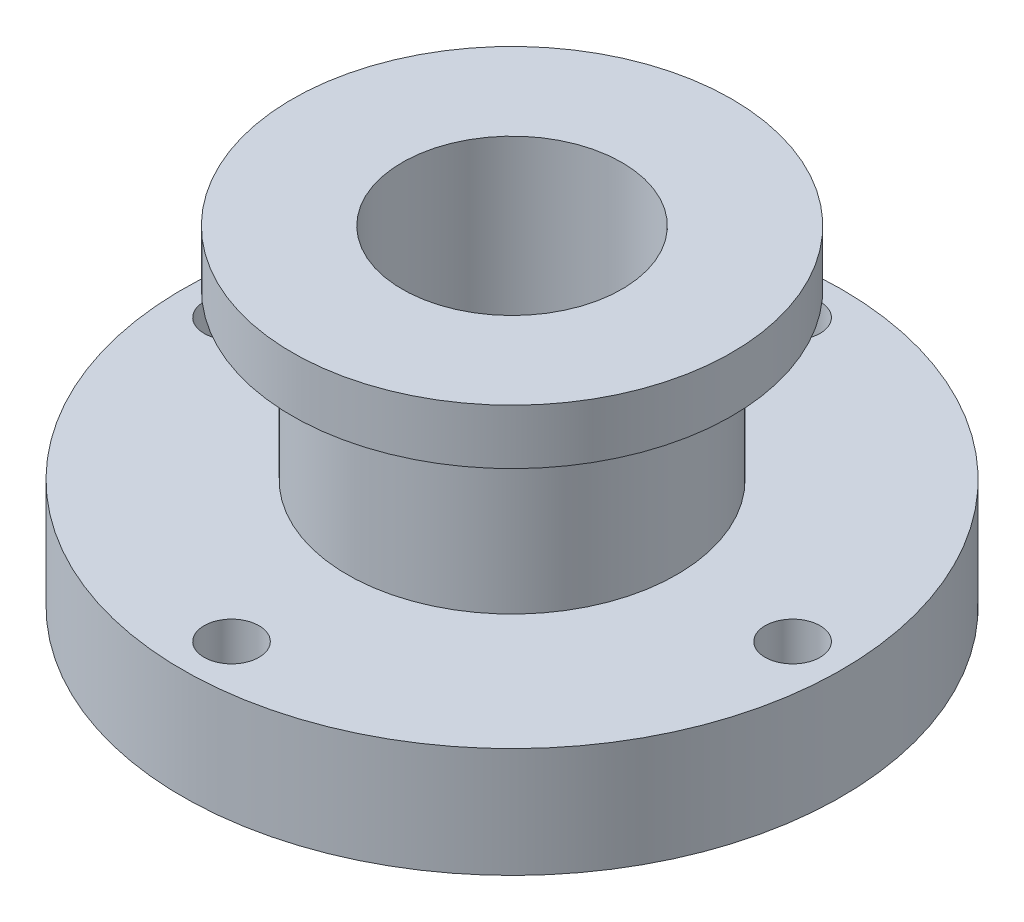
ISO-10303-21;
HEADER;
FILE_DESCRIPTION(('STEP AP214'),'2;1');
FILE_NAME('part.step','',(''),(''),'','','');
FILE_SCHEMA(('AUTOMOTIVE_DESIGN { 1 0 10303 214 1 1 1 1 }'));
ENDSEC;
DATA;
#1=APPLICATION_CONTEXT('core data for automotive mechanical design processes');
#2=APPLICATION_PROTOCOL_DEFINITION('international standard','automotive_design',2000,#1);
#3=PRODUCT_CONTEXT('',#1,'mechanical');
#4=PRODUCT('Part','Part','',(#3));
#5=PRODUCT_RELATED_PRODUCT_CATEGORY('part','',(#4));
#6=PRODUCT_DEFINITION_FORMATION('','',#4);
#7=PRODUCT_DEFINITION_CONTEXT('part definition',#1,'design');
#8=PRODUCT_DEFINITION('design','',#6,#7);
#9=PRODUCT_DEFINITION_SHAPE('','',#8);
#10=(LENGTH_UNIT() NAMED_UNIT(*) SI_UNIT(.MILLI.,.METRE.));
#11=(NAMED_UNIT(*) PLANE_ANGLE_UNIT() SI_UNIT($,.RADIAN.));
#12=(NAMED_UNIT(*) SI_UNIT($,.STERADIAN.) SOLID_ANGLE_UNIT());
#13=UNCERTAINTY_MEASURE_WITH_UNIT(LENGTH_MEASURE(1.E-05),#10,'distance_accuracy_value','');
#14=(GEOMETRIC_REPRESENTATION_CONTEXT(3) GLOBAL_UNCERTAINTY_ASSIGNED_CONTEXT((#13)) GLOBAL_UNIT_ASSIGNED_CONTEXT((#10,
#11,#12)) REPRESENTATION_CONTEXT('',''));
#15=CARTESIAN_POINT('',(0.,0.,0.));
#16=DIRECTION('',(0.,0.,1.));
#17=DIRECTION('',(1.,0.,0.));
#18=AXIS2_PLACEMENT_3D('',#15,#16,#17);
#19=CARTESIAN_POINT('',(0.,-251.612903225806,0.));
#20=DIRECTION('',(0.,-1.,0.));
#21=DIRECTION('',(0.,0.,-1.));
#22=AXIS2_PLACEMENT_3D('',#19,#20,#21);
#23=PLANE('',#22);
#24=CARTESIAN_POINT('',(0.,-251.612903225806,-255.365455534732));
#25=DIRECTION('',(0.,1.,0.));
#26=DIRECTION('',(0.,0.,1.));
#27=AXIS2_PLACEMENT_3D('',#24,#25,#26);
#28=CIRCLE('',#27,25.);
#29=CARTESIAN_POINT('',(0.,-251.612903225806,-230.365455534732));
#30=VERTEX_POINT('',#29);
#31=EDGE_CURVE('E65',#30,#30,#28,.T.);
#32=ORIENTED_EDGE('',*,*,#31,.T.);
#33=EDGE_LOOP('',(#32));
#34=FACE_BOUND('',#33,.T.);
#35=CARTESIAN_POINT('',(255.365455534739,-251.612903225806,-7.21101290261088E-12));
#36=DIRECTION('',(0.,1.,0.));
#37=DIRECTION('',(0.,0.,1.));
#38=AXIS2_PLACEMENT_3D('',#35,#36,#37);
#39=CIRCLE('',#38,25.0000000000057);
#40=CARTESIAN_POINT('',(255.365455534739,-251.612903225806,24.9999999999984));
#41=VERTEX_POINT('',#40);
#42=EDGE_CURVE('E81',#41,#41,#39,.T.);
#43=ORIENTED_EDGE('',*,*,#42,.T.);
#44=EDGE_LOOP('',(#43));
#45=FACE_BOUND('',#44,.T.);
#46=CARTESIAN_POINT('',(1.44220258052218E-11,-251.612903225806,255.365455534732));
#47=DIRECTION('',(0.,1.,0.));
#48=DIRECTION('',(0.,0.,1.));
#49=AXIS2_PLACEMENT_3D('',#46,#47,#48);
#50=CIRCLE('',#49,25.0000000000155);
#51=CARTESIAN_POINT('',(1.44220258052218E-11,-251.612903225806,280.365455534747));
#52=VERTEX_POINT('',#51);
#53=EDGE_CURVE('E75',#52,#52,#50,.T.);
#54=ORIENTED_EDGE('',*,*,#53,.T.);
#55=EDGE_LOOP('',(#54));
#56=FACE_BOUND('',#55,.T.);
#57=CARTESIAN_POINT('',(-255.365455534724,-251.612903225806,7.24228615138422E-12));
#58=DIRECTION('',(0.,1.,0.));
#59=DIRECTION('',(0.,0.,1.));
#60=AXIS2_PLACEMENT_3D('',#57,#58,#59);
#61=CIRCLE('',#60,25.0000000000116);
#62=CARTESIAN_POINT('',(-255.365455534724,-251.612903225806,25.0000000000188));
#63=VERTEX_POINT('',#62);
#64=EDGE_CURVE('E69',#63,#63,#61,.T.);
#65=ORIENTED_EDGE('',*,*,#64,.T.);
#66=EDGE_LOOP('',(#65));
#67=FACE_BOUND('',#66,.T.);
#68=CARTESIAN_POINT('',(0.,-251.612903225806,0.));
#69=DIRECTION('',(0.,-1.,0.));
#70=DIRECTION('',(0.,0.,-1.));
#71=AXIS2_PLACEMENT_3D('',#68,#69,#70);
#72=CIRCLE('',#71,300.);
#73=CARTESIAN_POINT('',(0.,-251.612903225806,-300.));
#74=VERTEX_POINT('',#73);
#75=EDGE_CURVE('E10',#74,#74,#72,.T.);
#76=ORIENTED_EDGE('',*,*,#75,.T.);
#77=EDGE_LOOP('',(#76));
#78=FACE_BOUND('',#77,.T.);
#79=ADVANCED_FACE('F34',(#34,#45,#56,#67,#78),#23,.T.);
#80=CARTESIAN_POINT('',(0.,-251.612903225806,0.));
#81=DIRECTION('',(0.,-1.,0.));
#82=DIRECTION('',(0.,0.,-1.));
#83=AXIS2_PLACEMENT_3D('',#80,#81,#82);
#84=CYLINDRICAL_SURFACE('',#83,300.);
#85=CARTESIAN_POINT('',(0.,-151.612903225806,0.));
#86=DIRECTION('',(0.,-1.,0.));
#87=DIRECTION('',(0.,0.,-1.));
#88=AXIS2_PLACEMENT_3D('',#85,#86,#87);
#89=CIRCLE('',#88,300.);
#90=CARTESIAN_POINT('',(0.,-151.612903225806,-300.));
#91=VERTEX_POINT('',#90);
#92=EDGE_CURVE('E40',#91,#91,#89,.T.);
#93=ORIENTED_EDGE('',*,*,#92,.T.);
#94=EDGE_LOOP('',(#93));
#95=FACE_BOUND('',#94,.T.);
#96=ORIENTED_EDGE('',*,*,#75,.F.);
#97=EDGE_LOOP('',(#96));
#98=FACE_BOUND('',#97,.T.);
#99=ADVANCED_FACE('F103',(#95,#98),#84,.T.);
#100=CARTESIAN_POINT('',(300.,-151.612903225806,0.));
#101=DIRECTION('',(0.,1.,0.));
#102=DIRECTION('',(0.,0.,1.));
#103=AXIS2_PLACEMENT_3D('',#100,#101,#102);
#104=PLANE('',#103);
#105=CARTESIAN_POINT('',(0.,-151.612903225806,-255.365455534732));
#106=DIRECTION('',(0.,1.,0.));
#107=DIRECTION('',(0.,0.,1.));
#108=AXIS2_PLACEMENT_3D('',#105,#106,#107);
#109=CIRCLE('',#108,25.);
#110=CARTESIAN_POINT('',(0.,-151.612903225806,-230.365455534732));
#111=VERTEX_POINT('',#110);
#112=EDGE_CURVE('E84',#111,#111,#109,.T.);
#113=ORIENTED_EDGE('',*,*,#112,.F.);
#114=EDGE_LOOP('',(#113));
#115=FACE_BOUND('',#114,.T.);
#116=CARTESIAN_POINT('',(255.365455534739,-151.612903225806,-7.21101290261088E-12));
#117=DIRECTION('',(0.,1.,0.));
#118=DIRECTION('',(0.,0.,1.));
#119=AXIS2_PLACEMENT_3D('',#116,#117,#118);
#120=CIRCLE('',#119,25.0000000000057);
#121=CARTESIAN_POINT('',(255.365455534739,-151.612903225806,24.9999999999984));
#122=VERTEX_POINT('',#121);
#123=EDGE_CURVE('E78',#122,#122,#120,.T.);
#124=ORIENTED_EDGE('',*,*,#123,.F.);
#125=EDGE_LOOP('',(#124));
#126=FACE_BOUND('',#125,.T.);
#127=CARTESIAN_POINT('',(1.44220258052218E-11,-151.612903225806,255.365455534732));
#128=DIRECTION('',(0.,1.,0.));
#129=DIRECTION('',(0.,0.,1.));
#130=AXIS2_PLACEMENT_3D('',#127,#128,#129);
#131=CIRCLE('',#130,25.0000000000155);
#132=CARTESIAN_POINT('',(1.44220258052218E-11,-151.612903225806,280.365455534747));
#133=VERTEX_POINT('',#132);
#134=EDGE_CURVE('E72',#133,#133,#131,.T.);
#135=ORIENTED_EDGE('',*,*,#134,.F.);
#136=EDGE_LOOP('',(#135));
#137=FACE_BOUND('',#136,.T.);
#138=CARTESIAN_POINT('',(-255.365455534724,-151.612903225806,7.24228615138422E-12));
#139=DIRECTION('',(0.,1.,0.));
#140=DIRECTION('',(0.,0.,1.));
#141=AXIS2_PLACEMENT_3D('',#138,#139,#140);
#142=CIRCLE('',#141,25.0000000000116);
#143=CARTESIAN_POINT('',(-255.365455534724,-151.612903225806,25.0000000000188));
#144=VERTEX_POINT('',#143);
#145=EDGE_CURVE('E66',#144,#144,#142,.T.);
#146=ORIENTED_EDGE('',*,*,#145,.F.);
#147=EDGE_LOOP('',(#146));
#148=FACE_BOUND('',#147,.T.);
#149=CARTESIAN_POINT('',(0.,-151.612903225806,0.));
#150=DIRECTION('',(0.,-1.,0.));
#151=DIRECTION('',(0.,0.,-1.));
#152=AXIS2_PLACEMENT_3D('',#149,#150,#151);
#153=CIRCLE('',#152,150.);
#154=CARTESIAN_POINT('',(0.,-151.612903225806,-150.));
#155=VERTEX_POINT('',#154);
#156=EDGE_CURVE('E44',#155,#155,#153,.T.);
#157=ORIENTED_EDGE('',*,*,#156,.T.);
#158=EDGE_LOOP('',(#157));
#159=FACE_BOUND('',#158,.T.);
#160=ORIENTED_EDGE('',*,*,#92,.F.);
#161=EDGE_LOOP('',(#160));
#162=FACE_BOUND('',#161,.T.);
#163=ADVANCED_FACE('F99',(#115,#126,#137,#148,#159,#162),#104,.T.);
#164=CARTESIAN_POINT('',(0.,-251.612903225806,0.));
#165=DIRECTION('',(0.,-1.,0.));
#166=DIRECTION('',(0.,0.,-1.));
#167=AXIS2_PLACEMENT_3D('',#164,#165,#166);
#168=CYLINDRICAL_SURFACE('',#167,150.);
#169=CARTESIAN_POINT('',(0.,-1.61290322580646,0.));
#170=DIRECTION('',(0.,-1.,0.));
#171=DIRECTION('',(0.,0.,-1.));
#172=AXIS2_PLACEMENT_3D('',#169,#170,#171);
#173=CIRCLE('',#172,150.);
#174=CARTESIAN_POINT('',(0.,-1.61290322580646,-150.));
#175=VERTEX_POINT('',#174);
#176=EDGE_CURVE('E48',#175,#175,#173,.T.);
#177=ORIENTED_EDGE('',*,*,#176,.T.);
#178=EDGE_LOOP('',(#177));
#179=FACE_BOUND('',#178,.T.);
#180=ORIENTED_EDGE('',*,*,#156,.F.);
#181=EDGE_LOOP('',(#180));
#182=FACE_BOUND('',#181,.T.);
#183=ADVANCED_FACE('F102',(#179,#182),#168,.T.);
#184=CARTESIAN_POINT('',(150.,-1.61290322580646,0.));
#185=DIRECTION('',(0.,-1.,0.));
#186=DIRECTION('',(0.,0.,-1.));
#187=AXIS2_PLACEMENT_3D('',#184,#185,#186);
#188=PLANE('',#187);
#189=CARTESIAN_POINT('',(0.,-1.61290322580646,0.));
#190=DIRECTION('',(0.,-1.,0.));
#191=DIRECTION('',(0.,0.,-1.));
#192=AXIS2_PLACEMENT_3D('',#189,#190,#191);
#193=CIRCLE('',#192,200.);
#194=CARTESIAN_POINT('',(0.,-1.61290322580646,-200.));
#195=VERTEX_POINT('',#194);
#196=EDGE_CURVE('E53',#195,#195,#193,.T.);
#197=ORIENTED_EDGE('',*,*,#196,.T.);
#198=EDGE_LOOP('',(#197));
#199=FACE_BOUND('',#198,.T.);
#200=ORIENTED_EDGE('',*,*,#176,.F.);
#201=EDGE_LOOP('',(#200));
#202=FACE_BOUND('',#201,.T.);
#203=ADVANCED_FACE('F115',(#199,#202),#188,.T.);
#204=CARTESIAN_POINT('',(0.,-251.612903225806,0.));
#205=DIRECTION('',(0.,-1.,0.));
#206=DIRECTION('',(0.,0.,-1.));
#207=AXIS2_PLACEMENT_3D('',#204,#205,#206);
#208=CYLINDRICAL_SURFACE('',#207,200.);
#209=CARTESIAN_POINT('',(0.,48.3870967741936,0.));
#210=DIRECTION('',(0.,-1.,0.));
#211=DIRECTION('',(0.,0.,-1.));
#212=AXIS2_PLACEMENT_3D('',#209,#210,#211);
#213=CIRCLE('',#212,200.);
#214=CARTESIAN_POINT('',(0.,48.3870967741936,-200.));
#215=VERTEX_POINT('',#214);
#216=EDGE_CURVE('E56',#215,#215,#213,.T.);
#217=ORIENTED_EDGE('',*,*,#216,.T.);
#218=EDGE_LOOP('',(#217));
#219=FACE_BOUND('',#218,.T.);
#220=ORIENTED_EDGE('',*,*,#196,.F.);
#221=EDGE_LOOP('',(#220));
#222=FACE_BOUND('',#221,.T.);
#223=ADVANCED_FACE('F121',(#219,#222),#208,.T.);
#224=CARTESIAN_POINT('',(152.822580645162,48.3870967741935,0.));
#225=DIRECTION('',(0.,1.,0.));
#226=DIRECTION('',(0.,0.,1.));
#227=AXIS2_PLACEMENT_3D('',#224,#225,#226);
#228=PLANE('',#227);
#229=CARTESIAN_POINT('',(0.,48.3870967741935,0.));
#230=DIRECTION('',(0.,-1.,0.));
#231=DIRECTION('',(0.,0.,-1.));
#232=AXIS2_PLACEMENT_3D('',#229,#230,#231);
#233=CIRCLE('',#232,100.);
#234=CARTESIAN_POINT('',(0.,48.3870967741935,-100.));
#235=VERTEX_POINT('',#234);
#236=EDGE_CURVE('E59',#235,#235,#233,.T.);
#237=ORIENTED_EDGE('',*,*,#236,.T.);
#238=EDGE_LOOP('',(#237));
#239=FACE_BOUND('',#238,.T.);
#240=ORIENTED_EDGE('',*,*,#216,.F.);
#241=EDGE_LOOP('',(#240));
#242=FACE_BOUND('',#241,.T.);
#243=ADVANCED_FACE('F189',(#239,#242),#228,.T.);
#244=CARTESIAN_POINT('',(0.,-251.612903225806,0.));
#245=DIRECTION('',(0.,-1.,0.));
#246=DIRECTION('',(0.,0.,-1.));
#247=AXIS2_PLACEMENT_3D('',#244,#245,#246);
#248=CYLINDRICAL_SURFACE('',#247,100.);
#249=CARTESIAN_POINT('',(0.,-151.612903225806,0.));
#250=DIRECTION('',(0.,-1.,0.));
#251=DIRECTION('',(0.,0.,-1.));
#252=AXIS2_PLACEMENT_3D('',#249,#250,#251);
#253=CIRCLE('',#252,100.);
#254=CARTESIAN_POINT('',(0.,-151.612903225806,-100.));
#255=VERTEX_POINT('',#254);
#256=EDGE_CURVE('E62',#255,#255,#253,.T.);
#257=ORIENTED_EDGE('',*,*,#256,.T.);
#258=EDGE_LOOP('',(#257));
#259=FACE_BOUND('',#258,.T.);
#260=ORIENTED_EDGE('',*,*,#236,.F.);
#261=EDGE_LOOP('',(#260));
#262=FACE_BOUND('',#261,.T.);
#263=ADVANCED_FACE('F185',(#259,#262),#248,.F.);
#264=CARTESIAN_POINT('',(100.,-151.612903225806,0.));
#265=DIRECTION('',(0.,1.,0.));
#266=DIRECTION('',(0.,0.,1.));
#267=AXIS2_PLACEMENT_3D('',#264,#265,#266);
#268=PLANE('',#267);
#269=ORIENTED_EDGE('',*,*,#256,.F.);
#270=EDGE_LOOP('',(#269));
#271=FACE_BOUND('',#270,.T.);
#272=ADVANCED_FACE('F150',(#271),#268,.T.);
#273=CARTESIAN_POINT('',(-255.365455534724,-251.612903225806,7.24228615138422E-12));
#274=DIRECTION('',(0.,1.,0.));
#275=DIRECTION('',(0.,0.,1.));
#276=AXIS2_PLACEMENT_3D('',#273,#274,#275);
#277=CYLINDRICAL_SURFACE('',#276,25.0000000000116);
#278=ORIENTED_EDGE('',*,*,#64,.F.);
#279=EDGE_LOOP('',(#278));
#280=FACE_BOUND('',#279,.T.);
#281=ORIENTED_EDGE('',*,*,#145,.T.);
#282=EDGE_LOOP('',(#281));
#283=FACE_BOUND('',#282,.T.);
#284=ADVANCED_FACE('F144',(#280,#283),#277,.F.);
#285=CARTESIAN_POINT('',(1.44220258052218E-11,-251.612903225806,255.365455534732));
#286=DIRECTION('',(0.,1.,0.));
#287=DIRECTION('',(0.,0.,1.));
#288=AXIS2_PLACEMENT_3D('',#285,#286,#287);
#289=CYLINDRICAL_SURFACE('',#288,25.0000000000155);
#290=ORIENTED_EDGE('',*,*,#53,.F.);
#291=EDGE_LOOP('',(#290));
#292=FACE_BOUND('',#291,.T.);
#293=ORIENTED_EDGE('',*,*,#134,.T.);
#294=EDGE_LOOP('',(#293));
#295=FACE_BOUND('',#294,.T.);
#296=ADVANCED_FACE('F149',(#292,#295),#289,.F.);
#297=CARTESIAN_POINT('',(255.365455534739,-251.612903225806,-7.21101290261088E-12));
#298=DIRECTION('',(0.,1.,0.));
#299=DIRECTION('',(0.,0.,1.));
#300=AXIS2_PLACEMENT_3D('',#297,#298,#299);
#301=CYLINDRICAL_SURFACE('',#300,25.0000000000057);
#302=ORIENTED_EDGE('',*,*,#42,.F.);
#303=EDGE_LOOP('',(#302));
#304=FACE_BOUND('',#303,.T.);
#305=ORIENTED_EDGE('',*,*,#123,.T.);
#306=EDGE_LOOP('',(#305));
#307=FACE_BOUND('',#306,.T.);
#308=ADVANCED_FACE('F95',(#304,#307),#301,.F.);
#309=CARTESIAN_POINT('',(0.,-251.612903225806,-255.365455534732));
#310=DIRECTION('',(0.,1.,0.));
#311=DIRECTION('',(0.,0.,1.));
#312=AXIS2_PLACEMENT_3D('',#309,#310,#311);
#313=CYLINDRICAL_SURFACE('',#312,25.);
#314=ORIENTED_EDGE('',*,*,#31,.F.);
#315=EDGE_LOOP('',(#314));
#316=FACE_BOUND('',#315,.T.);
#317=ORIENTED_EDGE('',*,*,#112,.T.);
#318=EDGE_LOOP('',(#317));
#319=FACE_BOUND('',#318,.T.);
#320=ADVANCED_FACE('F92',(#316,#319),#313,.F.);
#321=CLOSED_SHELL('',(#79,#99,#163,#183,#203,#223,#243,#263,#272,#284,#296,#308,#320));
#322=MANIFOLD_SOLID_BREP('B2',#321);
#323=ADVANCED_BREP_SHAPE_REPRESENTATION('',(#18,#322),#14);
#324=SHAPE_DEFINITION_REPRESENTATION(#9,#323);
ENDSEC;
END-ISO-10303-21;
